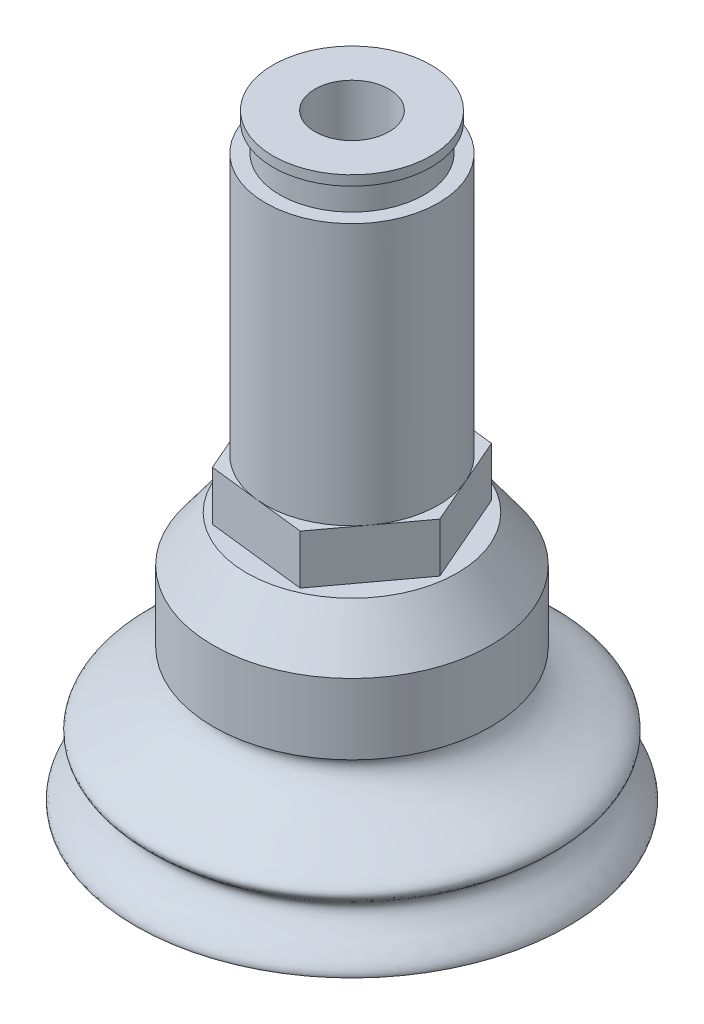
ISO-10303-21;
HEADER;
FILE_DESCRIPTION(('STEP AP214'),'2;1');
FILE_NAME('part.step','',(''),(''),'','','');
FILE_SCHEMA(('AUTOMOTIVE_DESIGN { 1 0 10303 214 1 1 1 1 }'));
ENDSEC;
DATA;
#1=APPLICATION_CONTEXT('core data for automotive mechanical design processes');
#2=APPLICATION_PROTOCOL_DEFINITION('international standard','automotive_design',2000,#1);
#3=PRODUCT_CONTEXT('',#1,'mechanical');
#4=PRODUCT('Part','Part','',(#3));
#5=PRODUCT_RELATED_PRODUCT_CATEGORY('part','',(#4));
#6=PRODUCT_DEFINITION_FORMATION('','',#4);
#7=PRODUCT_DEFINITION_CONTEXT('part definition',#1,'design');
#8=PRODUCT_DEFINITION('design','',#6,#7);
#9=PRODUCT_DEFINITION_SHAPE('','',#8);
#10=(LENGTH_UNIT() NAMED_UNIT(*) SI_UNIT(.MILLI.,.METRE.));
#11=(NAMED_UNIT(*) PLANE_ANGLE_UNIT() SI_UNIT($,.RADIAN.));
#12=(NAMED_UNIT(*) SI_UNIT($,.STERADIAN.) SOLID_ANGLE_UNIT());
#13=UNCERTAINTY_MEASURE_WITH_UNIT(LENGTH_MEASURE(1.E-05),#10,'distance_accuracy_value','');
#14=(GEOMETRIC_REPRESENTATION_CONTEXT(3) GLOBAL_UNCERTAINTY_ASSIGNED_CONTEXT((#13)) GLOBAL_UNIT_ASSIGNED_CONTEXT((#10,
#11,#12)) REPRESENTATION_CONTEXT('',''));
#15=CARTESIAN_POINT('',(0.,0.,0.));
#16=DIRECTION('',(0.,0.,1.));
#17=DIRECTION('',(1.,0.,0.));
#18=AXIS2_PLACEMENT_3D('',#15,#16,#17);
#19=CARTESIAN_POINT('',(0.,-7.7279974481691,0.));
#20=DIRECTION('',(0.,1.,0.));
#21=DIRECTION('',(0.,0.,1.));
#22=AXIS2_PLACEMENT_3D('',#19,#20,#21);
#23=PLANE('',#22);
#24=CARTESIAN_POINT('',(0.,-7.7279974481691,0.));
#25=DIRECTION('',(0.,1.,0.));
#26=DIRECTION('',(0.,0.,1.));
#27=AXIS2_PLACEMENT_3D('',#24,#25,#26);
#28=CIRCLE('',#27,7.);
#29=CARTESIAN_POINT('',(5.62530176593104,-7.7279974481691,4.16605089289763));
#30=VERTEX_POINT('',#29);
#31=CARTESIAN_POINT('',(6.42055678967371,-7.7279974481691,-2.78862878680093));
#32=VERTEX_POINT('',#31);
#33=EDGE_CURVE('E139',#30,#32,#28,.T.);
#34=ORIENTED_EDGE('',*,*,#33,.F.);
#35=DIRECTION('',(0.595150127556804,0.,-0.803614537990148));
#36=VECTOR('',#35,1.);
#37=CARTESIAN_POINT('',(3.22003116145891,-7.7279974481691,7.41382038173079));
#38=LINE('',#37,#36);
#39=CARTESIAN_POINT('',(8.03057237040317,-7.7279974481691,0.918281404064468));
#40=VERTEX_POINT('',#39);
#41=EDGE_CURVE('E127',#30,#40,#38,.T.);
#42=ORIENTED_EDGE('',*,*,#41,.T.);
#43=DIRECTION('',(-0.398375540971561,0.,-0.917222398524816));
#44=VECTOR('',#43,1.);
#45=CARTESIAN_POINT('',(8.03057237040317,-7.7279974481691,0.918281404064468));
#46=LINE('',#45,#44);
#47=EDGE_CURVE('E140',#40,#32,#46,.T.);
#48=ORIENTED_EDGE('',*,*,#47,.T.);
#49=EDGE_LOOP('',(#34,#42,#48));
#50=FACE_BOUND('',#49,.T.);
#51=ADVANCED_FACE('F47',(#50),#23,.T.);
#52=CARTESIAN_POINT('',(0.795255023742672,-7.7279974481691,-6.95467967969856));
#53=VERTEX_POINT('',#52);
#54=EDGE_CURVE('E56',#32,#53,#28,.T.);
#55=ORIENTED_EDGE('',*,*,#54,.F.);
#56=CARTESIAN_POINT('',(4.81054120894426,-7.7279974481691,-6.49553897766632));
#57=VERTEX_POINT('',#56);
#58=EDGE_CURVE('E155',#32,#57,#46,.T.);
#59=ORIENTED_EDGE('',*,*,#58,.T.);
#60=DIRECTION('',(-0.993525668528366,0.,-0.113607860534667));
#61=VECTOR('',#60,1.);
#62=CARTESIAN_POINT('',(4.81054120894426,-7.7279974481691,-6.49553897766632));
#63=LINE('',#62,#61);
#64=EDGE_CURVE('E156',#57,#53,#63,.T.);
#65=ORIENTED_EDGE('',*,*,#64,.T.);
#66=EDGE_LOOP('',(#55,#59,#65));
#67=FACE_BOUND('',#66,.T.);
#68=ADVANCED_FACE('F231',(#67),#23,.T.);
#69=CARTESIAN_POINT('',(-5.62530176593104,-7.7279974481691,-4.16605089289763));
#70=VERTEX_POINT('',#69);
#71=EDGE_CURVE('E263',#53,#70,#28,.T.);
#72=ORIENTED_EDGE('',*,*,#71,.F.);
#73=CARTESIAN_POINT('',(-3.22003116145891,-7.7279974481691,-7.41382038173079));
#74=VERTEX_POINT('',#73);
#75=EDGE_CURVE('E154',#53,#74,#63,.T.);
#76=ORIENTED_EDGE('',*,*,#75,.T.);
#77=DIRECTION('',(-0.595150127556804,0.,0.803614537990149));
#78=VECTOR('',#77,1.);
#79=CARTESIAN_POINT('',(-3.22003116145891,-7.7279974481691,-7.41382038173079));
#80=LINE('',#79,#78);
#81=EDGE_CURVE('E160',#74,#70,#80,.T.);
#82=ORIENTED_EDGE('',*,*,#81,.T.);
#83=EDGE_LOOP('',(#72,#76,#82));
#84=FACE_BOUND('',#83,.T.);
#85=ADVANCED_FACE('F236',(#84),#23,.T.);
#86=CARTESIAN_POINT('',(-6.42055678967371,-7.7279974481691,2.78862878680093));
#87=VERTEX_POINT('',#86);
#88=EDGE_CURVE('E148',#70,#87,#28,.T.);
#89=ORIENTED_EDGE('',*,*,#88,.F.);
#90=CARTESIAN_POINT('',(-8.03057237040316,-7.7279974481691,-0.918281404064467));
#91=VERTEX_POINT('',#90);
#92=EDGE_CURVE('E159',#70,#91,#80,.T.);
#93=ORIENTED_EDGE('',*,*,#92,.T.);
#94=DIRECTION('',(0.398375540971561,0.,0.917222398524816));
#95=VECTOR('',#94,1.);
#96=CARTESIAN_POINT('',(-8.03057237040316,-7.7279974481691,-0.918281404064467));
#97=LINE('',#96,#95);
#98=EDGE_CURVE('E164',#91,#87,#97,.T.);
#99=ORIENTED_EDGE('',*,*,#98,.T.);
#100=EDGE_LOOP('',(#89,#93,#99));
#101=FACE_BOUND('',#100,.T.);
#102=ADVANCED_FACE('F249',(#101),#23,.T.);
#103=CARTESIAN_POINT('',(-0.795255023742673,-7.7279974481691,6.95467967969856));
#104=VERTEX_POINT('',#103);
#105=EDGE_CURVE('E72',#87,#104,#28,.T.);
#106=ORIENTED_EDGE('',*,*,#105,.F.);
#107=CARTESIAN_POINT('',(-4.81054120894425,-7.7279974481691,6.49553897766633));
#108=VERTEX_POINT('',#107);
#109=EDGE_CURVE('E163',#87,#108,#97,.T.);
#110=ORIENTED_EDGE('',*,*,#109,.T.);
#111=DIRECTION('',(0.993525668528366,0.,0.113607860534668));
#112=VECTOR('',#111,1.);
#113=CARTESIAN_POINT('',(-4.81054120894425,-7.7279974481691,6.49553897766633));
#114=LINE('',#113,#112);
#115=EDGE_CURVE('E137',#108,#104,#114,.T.);
#116=ORIENTED_EDGE('',*,*,#115,.T.);
#117=EDGE_LOOP('',(#106,#110,#116));
#118=FACE_BOUND('',#117,.T.);
#119=ADVANCED_FACE('F226',(#118),#23,.T.);
#120=CARTESIAN_POINT('',(0.,-11.7279974481691,0.));
#121=DIRECTION('',(0.,1.,0.));
#122=DIRECTION('',(0.,0.,1.));
#123=AXIS2_PLACEMENT_3D('',#120,#121,#122);
#124=PLANE('',#123);
#125=DIRECTION('',(-0.398375540971561,0.,-0.917222398524816));
#126=VECTOR('',#125,1.);
#127=CARTESIAN_POINT('',(8.03057237040317,-11.7279974481691,0.918281404064468));
#128=LINE('',#127,#126);
#129=CARTESIAN_POINT('',(8.03057237040317,-11.7279974481691,0.918281404064468));
#130=VERTEX_POINT('',#129);
#131=CARTESIAN_POINT('',(4.81054120894426,-11.7279974481691,-6.49553897766632));
#132=VERTEX_POINT('',#131);
#133=EDGE_CURVE('E168',#130,#132,#128,.T.);
#134=ORIENTED_EDGE('',*,*,#133,.F.);
#135=DIRECTION('',(0.595150127556804,0.,-0.803614537990148));
#136=VECTOR('',#135,1.);
#137=CARTESIAN_POINT('',(3.22003116145891,-11.7279974481691,7.41382038173079));
#138=LINE('',#137,#136);
#139=CARTESIAN_POINT('',(3.22003116145891,-11.7279974481691,7.41382038173079));
#140=VERTEX_POINT('',#139);
#141=EDGE_CURVE('E183',#140,#130,#138,.T.);
#142=ORIENTED_EDGE('',*,*,#141,.F.);
#143=DIRECTION('',(0.993525668528366,0.,0.113607860534668));
#144=VECTOR('',#143,1.);
#145=CARTESIAN_POINT('',(-4.81054120894425,-11.7279974481691,6.49553897766633));
#146=LINE('',#145,#144);
#147=CARTESIAN_POINT('',(-4.81054120894425,-11.7279974481691,6.49553897766633));
#148=VERTEX_POINT('',#147);
#149=EDGE_CURVE('E180',#148,#140,#146,.T.);
#150=ORIENTED_EDGE('',*,*,#149,.F.);
#151=DIRECTION('',(0.398375540971561,0.,0.917222398524816));
#152=VECTOR('',#151,1.);
#153=CARTESIAN_POINT('',(-8.03057237040316,-11.7279974481691,-0.918281404064467));
#154=LINE('',#153,#152);
#155=CARTESIAN_POINT('',(-8.03057237040316,-11.7279974481691,-0.918281404064467));
#156=VERTEX_POINT('',#155);
#157=EDGE_CURVE('E177',#156,#148,#154,.T.);
#158=ORIENTED_EDGE('',*,*,#157,.F.);
#159=DIRECTION('',(-0.595150127556804,0.,0.803614537990149));
#160=VECTOR('',#159,1.);
#161=CARTESIAN_POINT('',(-3.22003116145891,-11.7279974481691,-7.41382038173079));
#162=LINE('',#161,#160);
#163=CARTESIAN_POINT('',(-3.22003116145891,-11.7279974481691,-7.41382038173079));
#164=VERTEX_POINT('',#163);
#165=EDGE_CURVE('E174',#164,#156,#162,.T.);
#166=ORIENTED_EDGE('',*,*,#165,.F.);
#167=DIRECTION('',(-0.993525668528366,0.,-0.113607860534667));
#168=VECTOR('',#167,1.);
#169=CARTESIAN_POINT('',(4.81054120894426,-11.7279974481691,-6.49553897766632));
#170=LINE('',#169,#168);
#171=EDGE_CURVE('E171',#132,#164,#170,.T.);
#172=ORIENTED_EDGE('',*,*,#171,.F.);
#173=EDGE_LOOP('',(#134,#142,#150,#158,#166,#172));
#174=FACE_BOUND('',#173,.T.);
#175=CARTESIAN_POINT('',(0.,-11.7279974481691,0.));
#176=DIRECTION('',(0.,1.,0.));
#177=DIRECTION('',(0.,0.,1.));
#178=AXIS2_PLACEMENT_3D('',#175,#176,#177);
#179=CIRCLE('',#178,8.52638887740251);
#180=CARTESIAN_POINT('',(0.,-11.7279974481691,8.52638887740251));
#181=VERTEX_POINT('',#180);
#182=EDGE_CURVE('E51',#181,#181,#179,.T.);
#183=ORIENTED_EDGE('',*,*,#182,.T.);
#184=EDGE_LOOP('',(#183));
#185=FACE_BOUND('',#184,.T.);
#186=ADVANCED_FACE('F49',(#174,#185),#124,.T.);
#187=CARTESIAN_POINT('',(0.,-11.7279974481691,0.));
#188=DIRECTION('',(0.,-1.,0.));
#189=DIRECTION('',(0.,0.,-1.));
#190=AXIS2_PLACEMENT_3D('',#187,#188,#189);
#191=CONICAL_SURFACE('',#190,8.52638887740251,0.633221429691031);
#192=CARTESIAN_POINT('',(0.,-15.4350385767846,0.));
#193=DIRECTION('',(0.,1.,0.));
#194=DIRECTION('',(0.,0.,1.));
#195=AXIS2_PLACEMENT_3D('',#192,#193,#194);
#196=CIRCLE('',#195,11.2475807151305);
#197=CARTESIAN_POINT('',(0.,-15.4350385767846,11.2475807151305));
#198=VERTEX_POINT('',#197);
#199=EDGE_CURVE('E150',#198,#198,#196,.T.);
#200=ORIENTED_EDGE('',*,*,#199,.T.);
#201=EDGE_LOOP('',(#200));
#202=FACE_BOUND('',#201,.T.);
#203=ORIENTED_EDGE('',*,*,#182,.F.);
#204=EDGE_LOOP('',(#203));
#205=FACE_BOUND('',#204,.T.);
#206=ADVANCED_FACE('F219',(#202,#205),#191,.T.);
#207=CARTESIAN_POINT('',(0.,56.8252700668012,0.));
#208=DIRECTION('',(0.,1.,0.));
#209=DIRECTION('',(0.,0.,1.));
#210=AXIS2_PLACEMENT_3D('',#207,#208,#209);
#211=CYLINDRICAL_SURFACE('',#210,11.2475807151305);
#212=CARTESIAN_POINT('',(0.,-21.1463831158481,0.));
#213=DIRECTION('',(0.,1.,0.));
#214=DIRECTION('',(0.,0.,1.));
#215=AXIS2_PLACEMENT_3D('',#212,#213,#214);
#216=CIRCLE('',#215,11.2475807151305);
#217=CARTESIAN_POINT('',(0.,-21.1463831158481,11.2475807151305));
#218=VERTEX_POINT('',#217);
#219=EDGE_CURVE('E331',#218,#218,#216,.T.);
#220=ORIENTED_EDGE('',*,*,#219,.T.);
#221=EDGE_LOOP('',(#220));
#222=FACE_BOUND('',#221,.T.);
#223=ORIENTED_EDGE('',*,*,#199,.F.);
#224=EDGE_LOOP('',(#223));
#225=FACE_BOUND('',#224,.T.);
#226=ADVANCED_FACE('F215',(#222,#225),#211,.T.);
#227=CARTESIAN_POINT('',(-11.2475807151305,-21.1463831158481,0.));
#228=CARTESIAN_POINT('',(-9.36907377274805,-21.8008602997607,0.));
#229=CARTESIAN_POINT('',(-10.8896897456351,-25.0793479955865,0.));
#230=CARTESIAN_POINT('',(-18.5193484047073,-26.3824233083622,0.));
#231=CARTESIAN_POINT('',(-13.6576263691636,-29.0450802886504,0.));
#232=CARTESIAN_POINT('',(-17.7283462588826,-31.0727744979301,0.));
#233=CARTESIAN_POINT('',(-17.5,-32.0279974481691,0.));
#234=B_SPLINE_CURVE_WITH_KNOTS('',3,(#227,#228,#229,#230,#231,#232,#233),.UNSPECIFIED.,.F.,.F.,
(4,1,1,1,4),(0.,0.239282786308588,0.633272553981943,0.728833693679855,1.),.UNSPECIFIED.);
#235=CARTESIAN_POINT('',(0.,56.8252700668012,0.));
#236=DIRECTION('',(0.,1.,0.));
#237=AXIS1_PLACEMENT('',#235,#236);
#238=SURFACE_OF_REVOLUTION('',#234,#237);
#239=CARTESIAN_POINT('',(0.,-32.0279974481691,0.));
#240=DIRECTION('',(0.,1.,0.));
#241=DIRECTION('',(0.,0.,1.));
#242=AXIS2_PLACEMENT_3D('',#239,#240,#241);
#243=CIRCLE('',#242,17.5);
#244=CARTESIAN_POINT('',(0.,-32.0279974481691,17.5));
#245=VERTEX_POINT('',#244);
#246=EDGE_CURVE('E328',#245,#245,#243,.T.);
#247=ORIENTED_EDGE('',*,*,#246,.T.);
#248=EDGE_LOOP('',(#247));
#249=FACE_BOUND('',#248,.T.);
#250=ORIENTED_EDGE('',*,*,#219,.F.);
#251=EDGE_LOOP('',(#250));
#252=FACE_BOUND('',#251,.T.);
#253=ADVANCED_FACE('F210',(#249,#252),#238,.F.);
#254=CARTESIAN_POINT('',(-16.2976116759866,-32.0279974481691,0.));
#255=DIRECTION('',(0.,-1.,0.));
#256=DIRECTION('',(0.,0.,-1.));
#257=AXIS2_PLACEMENT_3D('',#254,#255,#256);
#258=PLANE('',#257);
#259=CARTESIAN_POINT('',(0.,-32.0279974481691,0.));
#260=DIRECTION('',(0.,1.,0.));
#261=DIRECTION('',(0.,0.,1.));
#262=AXIS2_PLACEMENT_3D('',#259,#260,#261);
#263=CIRCLE('',#262,16.2976116759866);
#264=CARTESIAN_POINT('',(0.,-32.0279974481691,16.2976116759866));
#265=VERTEX_POINT('',#264);
#266=EDGE_CURVE('E327',#265,#265,#263,.T.);
#267=ORIENTED_EDGE('',*,*,#266,.T.);
#268=EDGE_LOOP('',(#267));
#269=FACE_BOUND('',#268,.T.);
#270=ORIENTED_EDGE('',*,*,#246,.F.);
#271=EDGE_LOOP('',(#270));
#272=FACE_BOUND('',#271,.T.);
#273=ADVANCED_FACE('F214',(#269,#272),#258,.T.);
#274=CARTESIAN_POINT('',(0.,-32.0279974481691,0.));
#275=DIRECTION('',(0.,-1.,0.));
#276=DIRECTION('',(0.,0.,-1.));
#277=AXIS2_PLACEMENT_3D('',#274,#275,#276);
#278=CONICAL_SURFACE('',#277,16.2976116759866,0.937872732160257);
#279=CARTESIAN_POINT('',(0.,-26.1381367038701,0.));
#280=DIRECTION('',(0.,1.,0.));
#281=DIRECTION('',(0.,0.,1.));
#282=AXIS2_PLACEMENT_3D('',#279,#280,#281);
#283=CIRCLE('',#282,8.26892600299509);
#284=CARTESIAN_POINT('',(0.,-26.1381367038701,8.26892600299509));
#285=VERTEX_POINT('',#284);
#286=EDGE_CURVE('E324',#285,#285,#283,.T.);
#287=ORIENTED_EDGE('',*,*,#286,.T.);
#288=EDGE_LOOP('',(#287));
#289=FACE_BOUND('',#288,.T.);
#290=ORIENTED_EDGE('',*,*,#266,.F.);
#291=EDGE_LOOP('',(#290));
#292=FACE_BOUND('',#291,.T.);
#293=ADVANCED_FACE('F313',(#289,#292),#278,.F.);
#294=CARTESIAN_POINT('',(0.,56.8252700668012,0.));
#295=DIRECTION('',(0.,1.,0.));
#296=DIRECTION('',(0.,0.,1.));
#297=AXIS2_PLACEMENT_3D('',#294,#295,#296);
#298=CYLINDRICAL_SURFACE('',#297,8.26892600299509);
#299=CARTESIAN_POINT('',(0.,-20.4549010124055,0.));
#300=DIRECTION('',(0.,1.,0.));
#301=DIRECTION('',(0.,0.,1.));
#302=AXIS2_PLACEMENT_3D('',#299,#300,#301);
#303=CIRCLE('',#302,8.26892600299509);
#304=CARTESIAN_POINT('',(0.,-20.4549010124055,8.26892600299509));
#305=VERTEX_POINT('',#304);
#306=EDGE_CURVE('E333',#305,#305,#303,.T.);
#307=ORIENTED_EDGE('',*,*,#306,.T.);
#308=EDGE_LOOP('',(#307));
#309=FACE_BOUND('',#308,.T.);
#310=ORIENTED_EDGE('',*,*,#286,.F.);
#311=EDGE_LOOP('',(#310));
#312=FACE_BOUND('',#311,.T.);
#313=ADVANCED_FACE('F310',(#309,#312),#298,.F.);
#314=CARTESIAN_POINT('',(0.,-20.4549010124055,0.));
#315=DIRECTION('',(0.,1.,0.));
#316=DIRECTION('',(0.,0.,1.));
#317=AXIS2_PLACEMENT_3D('',#314,#315,#316);
#318=CONICAL_SURFACE('',#317,8.26892600299509,1.2405430562457);
#319=CARTESIAN_POINT('',(0.,-19.8459829026057,0.));
#320=DIRECTION('',(0.,1.,0.));
#321=DIRECTION('',(0.,0.,1.));
#322=AXIS2_PLACEMENT_3D('',#319,#320,#321);
#323=CIRCLE('',#322,10.0451923911171);
#324=CARTESIAN_POINT('',(0.,-19.8459829026057,10.0451923911171));
#325=VERTEX_POINT('',#324);
#326=EDGE_CURVE('E344',#325,#325,#323,.T.);
#327=ORIENTED_EDGE('',*,*,#326,.T.);
#328=EDGE_LOOP('',(#327));
#329=FACE_BOUND('',#328,.T.);
#330=ORIENTED_EDGE('',*,*,#306,.F.);
#331=EDGE_LOOP('',(#330));
#332=FACE_BOUND('',#331,.T.);
#333=ADVANCED_FACE('F306',(#329,#332),#318,.F.);
#334=CARTESIAN_POINT('',(0.,56.8252700668012,0.));
#335=DIRECTION('',(0.,1.,0.));
#336=DIRECTION('',(0.,0.,1.));
#337=AXIS2_PLACEMENT_3D('',#334,#335,#336);
#338=CYLINDRICAL_SURFACE('',#337,10.0451923911171);
#339=CARTESIAN_POINT('',(0.,-16.1112851625003,0.));
#340=DIRECTION('',(0.,1.,0.));
#341=DIRECTION('',(0.,0.,1.));
#342=AXIS2_PLACEMENT_3D('',#339,#340,#341);
#343=CIRCLE('',#342,10.0451923911171);
#344=CARTESIAN_POINT('',(0.,-16.1112851625003,10.0451923911171));
#345=VERTEX_POINT('',#344);
#346=EDGE_CURVE('E346',#345,#345,#343,.T.);
#347=ORIENTED_EDGE('',*,*,#346,.T.);
#348=EDGE_LOOP('',(#347));
#349=FACE_BOUND('',#348,.T.);
#350=ORIENTED_EDGE('',*,*,#326,.F.);
#351=EDGE_LOOP('',(#350));
#352=FACE_BOUND('',#351,.T.);
#353=ADVANCED_FACE('F302',(#349,#352),#338,.F.);
#354=CARTESIAN_POINT('',(0.,-16.1112851625003,0.));
#355=DIRECTION('',(0.,-1.,0.));
#356=DIRECTION('',(0.,0.,-1.));
#357=AXIS2_PLACEMENT_3D('',#354,#355,#356);
#358=CONICAL_SURFACE('',#357,10.0451923911171,0.592493921147703);
#359=CARTESIAN_POINT('',(0.,-13.4726400200346,0.));
#360=DIRECTION('',(0.,1.,0.));
#361=DIRECTION('',(0.,0.,1.));
#362=AXIS2_PLACEMENT_3D('',#359,#360,#361);
#363=CIRCLE('',#362,8.26892600299509);
#364=CARTESIAN_POINT('',(0.,-13.4726400200346,8.26892600299509));
#365=VERTEX_POINT('',#364);
#366=EDGE_CURVE('E200',#365,#365,#363,.T.);
#367=ORIENTED_EDGE('',*,*,#366,.T.);
#368=EDGE_LOOP('',(#367));
#369=FACE_BOUND('',#368,.T.);
#370=ORIENTED_EDGE('',*,*,#346,.F.);
#371=EDGE_LOOP('',(#370));
#372=FACE_BOUND('',#371,.T.);
#373=ADVANCED_FACE('F298',(#369,#372),#358,.F.);
#374=CARTESIAN_POINT('',(0.,-13.4726400200346,0.));
#375=DIRECTION('',(0.,-1.,0.));
#376=DIRECTION('',(0.,0.,-1.));
#377=AXIS2_PLACEMENT_3D('',#374,#375,#376);
#378=PLANE('',#377);
#379=CARTESIAN_POINT('',(0.,-13.4726400200346,0.));
#380=DIRECTION('',(0.,-1.,0.));
#381=DIRECTION('',(0.,0.,-1.));
#382=AXIS2_PLACEMENT_3D('',#379,#380,#381);
#383=CIRCLE('',#382,3.);
#384=CARTESIAN_POINT('',(0.,-13.4726400200346,-3.));
#385=VERTEX_POINT('',#384);
#386=EDGE_CURVE('E567',#385,#385,#383,.T.);
#387=ORIENTED_EDGE('',*,*,#386,.F.);
#388=EDGE_LOOP('',(#387));
#389=FACE_BOUND('',#388,.T.);
#390=ORIENTED_EDGE('',*,*,#366,.F.);
#391=EDGE_LOOP('',(#390));
#392=FACE_BOUND('',#391,.T.);
#393=ADVANCED_FACE('F295',(#389,#392),#378,.T.);
#394=CARTESIAN_POINT('',(8.03057237040317,-7.7279974481691,0.918281404064468));
#395=DIRECTION('',(-0.917222398524816,0.,0.398375540971561));
#396=DIRECTION('',(0.398375540971561,0.,0.917222398524816));
#397=AXIS2_PLACEMENT_3D('',#394,#395,#396);
#398=PLANE('',#397);
#399=ORIENTED_EDGE('',*,*,#133,.T.);
#400=DIRECTION('',(0.,-1.,0.));
#401=VECTOR('',#400,1.);
#402=CARTESIAN_POINT('',(4.81054120894426,-7.7279974481691,-6.49553897766632));
#403=LINE('',#402,#401);
#404=EDGE_CURVE('E197',#57,#132,#403,.T.);
#405=ORIENTED_EDGE('',*,*,#404,.F.);
#406=ORIENTED_EDGE('',*,*,#58,.F.);
#407=ORIENTED_EDGE('',*,*,#47,.F.);
#408=DIRECTION('',(0.,-1.,0.));
#409=VECTOR('',#408,1.);
#410=CARTESIAN_POINT('',(8.03057237040317,-7.7279974481691,0.918281404064468));
#411=LINE('',#410,#409);
#412=EDGE_CURVE('E126',#40,#130,#411,.T.);
#413=ORIENTED_EDGE('',*,*,#412,.T.);
#414=EDGE_LOOP('',(#399,#405,#406,#407,#413));
#415=FACE_BOUND('',#414,.T.);
#416=ADVANCED_FACE('F273',(#415),#398,.F.);
#417=CARTESIAN_POINT('',(4.81054120894426,-7.7279974481691,-6.49553897766632));
#418=DIRECTION('',(-0.113607860534667,0.,0.993525668528366));
#419=DIRECTION('',(0.993525668528366,0.,0.113607860534667));
#420=AXIS2_PLACEMENT_3D('',#417,#418,#419);
#421=PLANE('',#420);
#422=ORIENTED_EDGE('',*,*,#171,.T.);
#423=DIRECTION('',(0.,-1.,0.));
#424=VECTOR('',#423,1.);
#425=CARTESIAN_POINT('',(-3.22003116145891,-7.7279974481691,-7.41382038173079));
#426=LINE('',#425,#424);
#427=EDGE_CURVE('E194',#74,#164,#426,.T.);
#428=ORIENTED_EDGE('',*,*,#427,.F.);
#429=ORIENTED_EDGE('',*,*,#75,.F.);
#430=ORIENTED_EDGE('',*,*,#64,.F.);
#431=ORIENTED_EDGE('',*,*,#404,.T.);
#432=EDGE_LOOP('',(#422,#428,#429,#430,#431));
#433=FACE_BOUND('',#432,.T.);
#434=ADVANCED_FACE('F275',(#433),#421,.F.);
#435=CARTESIAN_POINT('',(-3.22003116145891,-7.7279974481691,-7.41382038173079));
#436=DIRECTION('',(0.803614537990149,0.,0.595150127556804));
#437=DIRECTION('',(0.595150127556804,0.,-0.803614537990148));
#438=AXIS2_PLACEMENT_3D('',#435,#436,#437);
#439=PLANE('',#438);
#440=ORIENTED_EDGE('',*,*,#165,.T.);
#441=DIRECTION('',(0.,-1.,0.));
#442=VECTOR('',#441,1.);
#443=CARTESIAN_POINT('',(-8.03057237040316,-7.7279974481691,-0.918281404064467));
#444=LINE('',#443,#442);
#445=EDGE_CURVE('E191',#91,#156,#444,.T.);
#446=ORIENTED_EDGE('',*,*,#445,.F.);
#447=ORIENTED_EDGE('',*,*,#92,.F.);
#448=ORIENTED_EDGE('',*,*,#81,.F.);
#449=ORIENTED_EDGE('',*,*,#427,.T.);
#450=EDGE_LOOP('',(#440,#446,#447,#448,#449));
#451=FACE_BOUND('',#450,.T.);
#452=ADVANCED_FACE('F266',(#451),#439,.F.);
#453=CARTESIAN_POINT('',(-8.03057237040316,-7.7279974481691,-0.918281404064467));
#454=DIRECTION('',(0.917222398524816,0.,-0.398375540971561));
#455=DIRECTION('',(-0.398375540971561,0.,-0.917222398524816));
#456=AXIS2_PLACEMENT_3D('',#453,#454,#455);
#457=PLANE('',#456);
#458=ORIENTED_EDGE('',*,*,#157,.T.);
#459=DIRECTION('',(0.,-1.,0.));
#460=VECTOR('',#459,1.);
#461=CARTESIAN_POINT('',(-4.81054120894425,-7.7279974481691,6.49553897766633));
#462=LINE('',#461,#460);
#463=EDGE_CURVE('E188',#108,#148,#462,.T.);
#464=ORIENTED_EDGE('',*,*,#463,.F.);
#465=ORIENTED_EDGE('',*,*,#109,.F.);
#466=ORIENTED_EDGE('',*,*,#98,.F.);
#467=ORIENTED_EDGE('',*,*,#445,.T.);
#468=EDGE_LOOP('',(#458,#464,#465,#466,#467));
#469=FACE_BOUND('',#468,.T.);
#470=ADVANCED_FACE('F277',(#469),#457,.F.);
#471=CARTESIAN_POINT('',(-4.81054120894425,-7.7279974481691,6.49553897766633));
#472=DIRECTION('',(0.113607860534667,0.,-0.993525668528365));
#473=DIRECTION('',(-0.993525668528366,0.,-0.113607860534668));
#474=AXIS2_PLACEMENT_3D('',#471,#472,#473);
#475=PLANE('',#474);
#476=ORIENTED_EDGE('',*,*,#149,.T.);
#477=DIRECTION('',(0.,-1.,0.));
#478=VECTOR('',#477,1.);
#479=CARTESIAN_POINT('',(3.22003116145891,-7.7279974481691,7.41382038173079));
#480=LINE('',#479,#478);
#481=CARTESIAN_POINT('',(3.22003116145891,-7.7279974481691,7.41382038173079));
#482=VERTEX_POINT('',#481);
#483=EDGE_CURVE('E186',#482,#140,#480,.T.);
#484=ORIENTED_EDGE('',*,*,#483,.F.);
#485=EDGE_CURVE('E122',#104,#482,#114,.T.);
#486=ORIENTED_EDGE('',*,*,#485,.F.);
#487=ORIENTED_EDGE('',*,*,#115,.F.);
#488=ORIENTED_EDGE('',*,*,#463,.T.);
#489=EDGE_LOOP('',(#476,#484,#486,#487,#488));
#490=FACE_BOUND('',#489,.T.);
#491=ADVANCED_FACE('F247',(#490),#475,.F.);
#492=CARTESIAN_POINT('',(3.22003116145891,-7.7279974481691,7.41382038173079));
#493=DIRECTION('',(-0.803614537990149,0.,-0.595150127556804));
#494=DIRECTION('',(-0.595150127556804,0.,0.803614537990149));
#495=AXIS2_PLACEMENT_3D('',#492,#493,#494);
#496=PLANE('',#495);
#497=ORIENTED_EDGE('',*,*,#141,.T.);
#498=ORIENTED_EDGE('',*,*,#412,.F.);
#499=ORIENTED_EDGE('',*,*,#41,.F.);
#500=EDGE_CURVE('E119',#482,#30,#38,.T.);
#501=ORIENTED_EDGE('',*,*,#500,.F.);
#502=ORIENTED_EDGE('',*,*,#483,.T.);
#503=EDGE_LOOP('',(#497,#498,#499,#501,#502));
#504=FACE_BOUND('',#503,.T.);
#505=ADVANCED_FACE('F132',(#504),#496,.F.);
#506=EDGE_CURVE('E64',#104,#30,#28,.T.);
#507=ORIENTED_EDGE('',*,*,#506,.F.);
#508=ORIENTED_EDGE('',*,*,#485,.T.);
#509=ORIENTED_EDGE('',*,*,#500,.T.);
#510=EDGE_LOOP('',(#507,#508,#509));
#511=FACE_BOUND('',#510,.T.);
#512=ADVANCED_FACE('F121',(#511),#23,.T.);
#513=CARTESIAN_POINT('',(0.,13.4720025518309,0.));
#514=DIRECTION('',(0.,-1.,0.));
#515=DIRECTION('',(0.,0.,-1.));
#516=AXIS2_PLACEMENT_3D('',#513,#514,#515);
#517=CYLINDRICAL_SURFACE('',#516,7.);
#518=CARTESIAN_POINT('',(0.,13.4720025518309,0.));
#519=DIRECTION('',(0.,1.,0.));
#520=DIRECTION('',(0.,0.,1.));
#521=AXIS2_PLACEMENT_3D('',#518,#519,#520);
#522=CIRCLE('',#521,7.);
#523=CARTESIAN_POINT('',(0.,13.4720025518309,7.));
#524=VERTEX_POINT('',#523);
#525=EDGE_CURVE('E143',#524,#524,#522,.T.);
#526=ORIENTED_EDGE('',*,*,#525,.F.);
#527=EDGE_LOOP('',(#526));
#528=FACE_BOUND('',#527,.T.);
#529=ORIENTED_EDGE('',*,*,#33,.T.);
#530=ORIENTED_EDGE('',*,*,#54,.T.);
#531=ORIENTED_EDGE('',*,*,#71,.T.);
#532=ORIENTED_EDGE('',*,*,#88,.T.);
#533=ORIENTED_EDGE('',*,*,#105,.T.);
#534=ORIENTED_EDGE('',*,*,#506,.T.);
#535=EDGE_LOOP('',(#529,#530,#531,#532,#533,#534));
#536=FACE_BOUND('',#535,.T.);
#537=ADVANCED_FACE('F146',(#528,#536),#517,.T.);
#538=CARTESIAN_POINT('',(0.,13.4720025518309,0.));
#539=DIRECTION('',(0.,1.,0.));
#540=DIRECTION('',(0.,0.,1.));
#541=AXIS2_PLACEMENT_3D('',#538,#539,#540);
#542=PLANE('',#541);
#543=CARTESIAN_POINT('',(0.,13.4720025518309,0.));
#544=DIRECTION('',(0.,1.,0.));
#545=DIRECTION('',(0.,0.,1.));
#546=AXIS2_PLACEMENT_3D('',#543,#544,#545);
#547=CIRCLE('',#546,5.85148114612003);
#548=CARTESIAN_POINT('',(0.,13.4720025518309,5.85148114612003));
#549=VERTEX_POINT('',#548);
#550=EDGE_CURVE('E11',#549,#549,#547,.T.);
#551=ORIENTED_EDGE('',*,*,#550,.F.);
#552=EDGE_LOOP('',(#551));
#553=FACE_BOUND('',#552,.T.);
#554=ORIENTED_EDGE('',*,*,#525,.T.);
#555=EDGE_LOOP('',(#554));
#556=FACE_BOUND('',#555,.T.);
#557=ADVANCED_FACE('F245',(#553,#556),#542,.T.);
#558=CARTESIAN_POINT('',(0.,15.6720025518309,0.));
#559=DIRECTION('',(0.,-1.,0.));
#560=DIRECTION('',(0.,0.,-1.));
#561=AXIS2_PLACEMENT_3D('',#558,#559,#560);
#562=CYLINDRICAL_SURFACE('',#561,5.85148114612003);
#563=CARTESIAN_POINT('',(0.,15.6720025518309,0.));
#564=DIRECTION('',(0.,1.,0.));
#565=DIRECTION('',(0.,0.,1.));
#566=AXIS2_PLACEMENT_3D('',#563,#564,#565);
#567=CIRCLE('',#566,5.85148114612003);
#568=CARTESIAN_POINT('',(0.,15.6720025518309,5.85148114612003));
#569=VERTEX_POINT('',#568);
#570=EDGE_CURVE('E144',#569,#569,#567,.T.);
#571=ORIENTED_EDGE('',*,*,#570,.F.);
#572=EDGE_LOOP('',(#571));
#573=FACE_BOUND('',#572,.T.);
#574=ORIENTED_EDGE('',*,*,#550,.T.);
#575=EDGE_LOOP('',(#574));
#576=FACE_BOUND('',#575,.T.);
#577=ADVANCED_FACE('F491',(#573,#576),#562,.T.);
#578=CARTESIAN_POINT('',(0.,16.4720025518309,0.));
#579=DIRECTION('',(0.,-1.,0.));
#580=DIRECTION('',(0.,0.,-1.));
#581=AXIS2_PLACEMENT_3D('',#578,#579,#580);
#582=CYLINDRICAL_SURFACE('',#581,6.3929931615405);
#583=CARTESIAN_POINT('',(0.,16.4720025518309,0.));
#584=DIRECTION('',(0.,1.,0.));
#585=DIRECTION('',(0.,0.,1.));
#586=AXIS2_PLACEMENT_3D('',#583,#584,#585);
#587=CIRCLE('',#586,6.3929931615405);
#588=CARTESIAN_POINT('',(0.,16.4720025518309,6.3929931615405));
#589=VERTEX_POINT('',#588);
#590=EDGE_CURVE('E575',#589,#589,#587,.T.);
#591=ORIENTED_EDGE('',*,*,#590,.F.);
#592=EDGE_LOOP('',(#591));
#593=FACE_BOUND('',#592,.T.);
#594=CARTESIAN_POINT('',(0.,15.6720025518309,0.));
#595=DIRECTION('',(0.,1.,0.));
#596=DIRECTION('',(0.,0.,1.));
#597=AXIS2_PLACEMENT_3D('',#594,#595,#596);
#598=CIRCLE('',#597,6.3929931615405);
#599=CARTESIAN_POINT('',(0.,15.6720025518309,6.3929931615405));
#600=VERTEX_POINT('',#599);
#601=EDGE_CURVE('E572',#600,#600,#598,.T.);
#602=ORIENTED_EDGE('',*,*,#601,.T.);
#603=EDGE_LOOP('',(#602));
#604=FACE_BOUND('',#603,.T.);
#605=ADVANCED_FACE('F503',(#593,#604),#582,.T.);
#606=CARTESIAN_POINT('',(0.,16.4720025518309,0.));
#607=DIRECTION('',(0.,1.,0.));
#608=DIRECTION('',(0.,0.,1.));
#609=AXIS2_PLACEMENT_3D('',#606,#607,#608);
#610=PLANE('',#609);
#611=CARTESIAN_POINT('',(0.,16.4720025518309,0.));
#612=DIRECTION('',(0.,1.,0.));
#613=DIRECTION('',(0.,0.,1.));
#614=AXIS2_PLACEMENT_3D('',#611,#612,#613);
#615=CIRCLE('',#614,3.);
#616=CARTESIAN_POINT('',(0.,16.4720025518309,3.));
#617=VERTEX_POINT('',#616);
#618=EDGE_CURVE('E570',#617,#617,#615,.T.);
#619=ORIENTED_EDGE('',*,*,#618,.F.);
#620=EDGE_LOOP('',(#619));
#621=FACE_BOUND('',#620,.T.);
#622=ORIENTED_EDGE('',*,*,#590,.T.);
#623=EDGE_LOOP('',(#622));
#624=FACE_BOUND('',#623,.T.);
#625=ADVANCED_FACE('F515',(#621,#624),#610,.T.);
#626=CARTESIAN_POINT('',(0.,15.6720025518309,0.));
#627=DIRECTION('',(0.,1.,0.));
#628=DIRECTION('',(0.,0.,1.));
#629=AXIS2_PLACEMENT_3D('',#626,#627,#628);
#630=PLANE('',#629);
#631=ORIENTED_EDGE('',*,*,#570,.T.);
#632=EDGE_LOOP('',(#631));
#633=FACE_BOUND('',#632,.T.);
#634=ORIENTED_EDGE('',*,*,#601,.F.);
#635=EDGE_LOOP('',(#634));
#636=FACE_BOUND('',#635,.T.);
#637=ADVANCED_FACE('F524',(#633,#636),#630,.F.);
#638=CARTESIAN_POINT('',(0.,-42.3279974481691,0.));
#639=DIRECTION('',(0.,1.,0.));
#640=DIRECTION('',(0.,0.,1.));
#641=AXIS2_PLACEMENT_3D('',#638,#639,#640);
#642=CYLINDRICAL_SURFACE('',#641,3.);
#643=ORIENTED_EDGE('',*,*,#386,.T.);
#644=EDGE_LOOP('',(#643));
#645=FACE_BOUND('',#644,.T.);
#646=ORIENTED_EDGE('',*,*,#618,.T.);
#647=EDGE_LOOP('',(#646));
#648=FACE_BOUND('',#647,.T.);
#649=ADVANCED_FACE('F529',(#645,#648),#642,.F.);
#650=CLOSED_SHELL('',(#51,#68,#85,#102,#119,#186,#206,#226,#253,#273,#293,#313,#333,#353,#373,
#393,#416,#434,#452,#470,#491,#505,#512,#537,#557,#577,#605,#625,#637,#649));
#651=MANIFOLD_SOLID_BREP('B2',#650);
#652=ADVANCED_BREP_SHAPE_REPRESENTATION('',(#18,#651),#14);
#653=SHAPE_DEFINITION_REPRESENTATION(#9,#652);
ENDSEC;
END-ISO-10303-21;
